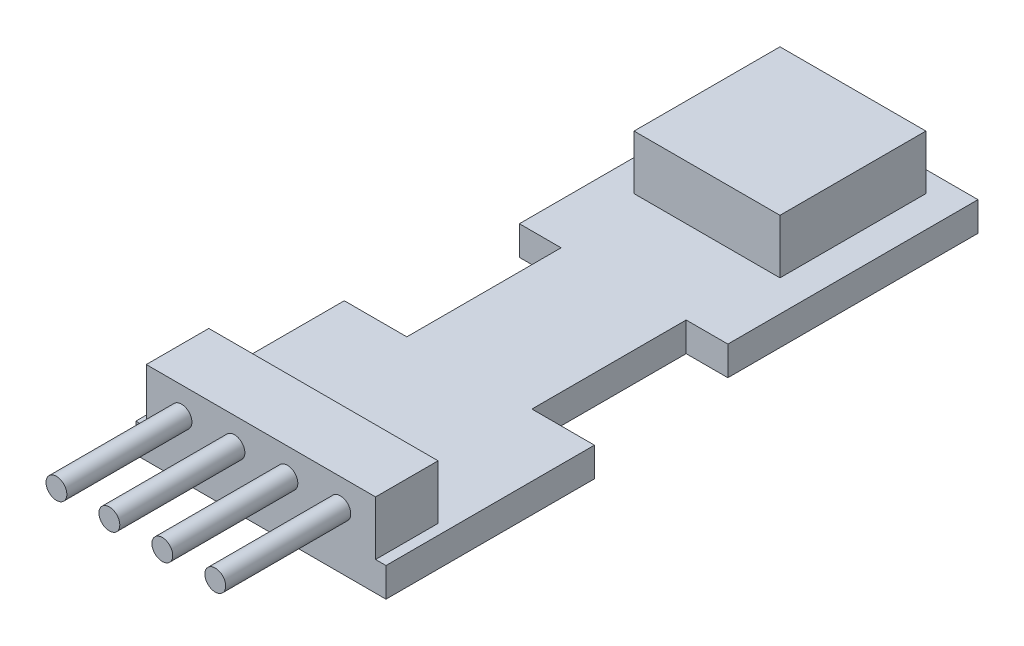
ISO-10303-21;
HEADER;
FILE_DESCRIPTION(('STEP AP214'),'2;1');
FILE_NAME('part.step','',(''),(''),'','','');
FILE_SCHEMA(('AUTOMOTIVE_DESIGN { 1 0 10303 214 1 1 1 1 }'));
ENDSEC;
DATA;
#1=APPLICATION_CONTEXT('core data for automotive mechanical design processes');
#2=APPLICATION_PROTOCOL_DEFINITION('international standard','automotive_design',2000,#1);
#3=PRODUCT_CONTEXT('',#1,'mechanical');
#4=PRODUCT('Part','Part','',(#3));
#5=PRODUCT_RELATED_PRODUCT_CATEGORY('part','',(#4));
#6=PRODUCT_DEFINITION_FORMATION('','',#4);
#7=PRODUCT_DEFINITION_CONTEXT('part definition',#1,'design');
#8=PRODUCT_DEFINITION('design','',#6,#7);
#9=PRODUCT_DEFINITION_SHAPE('','',#8);
#10=(LENGTH_UNIT() NAMED_UNIT(*) SI_UNIT(.MILLI.,.METRE.));
#11=(NAMED_UNIT(*) PLANE_ANGLE_UNIT() SI_UNIT($,.RADIAN.));
#12=(NAMED_UNIT(*) SI_UNIT($,.STERADIAN.) SOLID_ANGLE_UNIT());
#13=UNCERTAINTY_MEASURE_WITH_UNIT(LENGTH_MEASURE(1.E-05),#10,'distance_accuracy_value','');
#14=(GEOMETRIC_REPRESENTATION_CONTEXT(3) GLOBAL_UNCERTAINTY_ASSIGNED_CONTEXT((#13)) GLOBAL_UNIT_ASSIGNED_CONTEXT((#10,
#11,#12)) REPRESENTATION_CONTEXT('',''));
#15=CARTESIAN_POINT('',(0.,0.,0.));
#16=DIRECTION('',(0.,0.,1.));
#17=DIRECTION('',(1.,0.,0.));
#18=AXIS2_PLACEMENT_3D('',#15,#16,#17);
#19=CARTESIAN_POINT('',(0.,0.7,0.));
#20=DIRECTION('',(0.,1.,0.));
#21=DIRECTION('',(0.,0.,1.));
#22=AXIS2_PLACEMENT_3D('',#19,#20,#21);
#23=PLANE('',#22);
#24=DIRECTION('',(1.,0.,0.));
#25=VECTOR('',#24,1.);
#26=CARTESIAN_POINT('',(1.25,0.7,-10.7));
#27=LINE('',#26,#25);
#28=CARTESIAN_POINT('',(1.25,0.7,-10.7));
#29=VERTEX_POINT('',#28);
#30=CARTESIAN_POINT('',(4.75,0.7,-10.7));
#31=VERTEX_POINT('',#30);
#32=EDGE_CURVE('E206',#29,#31,#27,.T.);
#33=ORIENTED_EDGE('',*,*,#32,.F.);
#34=DIRECTION('',(0.,0.,1.));
#35=VECTOR('',#34,1.);
#36=CARTESIAN_POINT('',(1.25,0.7,-14.2));
#37=LINE('',#36,#35);
#38=CARTESIAN_POINT('',(1.25,0.7,-14.2));
#39=VERTEX_POINT('',#38);
#40=EDGE_CURVE('E201',#39,#29,#37,.T.);
#41=ORIENTED_EDGE('',*,*,#40,.F.);
#42=DIRECTION('',(-1.,0.,0.));
#43=VECTOR('',#42,1.);
#44=CARTESIAN_POINT('',(1.25,0.7,-14.2));
#45=LINE('',#44,#43);
#46=CARTESIAN_POINT('',(4.75,0.7,-14.2));
#47=VERTEX_POINT('',#46);
#48=EDGE_CURVE('E217',#47,#39,#45,.T.);
#49=ORIENTED_EDGE('',*,*,#48,.F.);
#50=DIRECTION('',(0.,0.,-1.));
#51=VECTOR('',#50,1.);
#52=CARTESIAN_POINT('',(4.75,0.7,-14.2));
#53=LINE('',#52,#51);
#54=EDGE_CURVE('E229',#31,#47,#53,.T.);
#55=ORIENTED_EDGE('',*,*,#54,.F.);
#56=EDGE_LOOP('',(#33,#41,#49,#55));
#57=FACE_BOUND('',#56,.T.);
#58=DIRECTION('',(1.,0.,0.));
#59=VECTOR('',#58,1.);
#60=CARTESIAN_POINT('',(0.,0.7,0.));
#61=LINE('',#60,#59);
#62=CARTESIAN_POINT('',(0.,0.7,0.));
#63=VERTEX_POINT('',#62);
#64=CARTESIAN_POINT('',(0.249999999999999,0.7,0.));
#65=VERTEX_POINT('',#64);
#66=EDGE_CURVE('E249',#63,#65,#61,.T.);
#67=ORIENTED_EDGE('',*,*,#66,.T.);
#68=DIRECTION('',(0.,0.,1.));
#69=VECTOR('',#68,1.);
#70=CARTESIAN_POINT('',(0.249999999999999,0.7,0.));
#71=LINE('',#70,#69);
#72=CARTESIAN_POINT('',(0.249999999999999,0.7,-1.5));
#73=VERTEX_POINT('',#72);
#74=EDGE_CURVE('E60',#73,#65,#71,.T.);
#75=ORIENTED_EDGE('',*,*,#74,.F.);
#76=DIRECTION('',(-1.,0.,0.));
#77=VECTOR('',#76,1.);
#78=CARTESIAN_POINT('',(0.249999999999999,0.7,-1.5));
#79=LINE('',#78,#77);
#80=CARTESIAN_POINT('',(5.75,0.7,-1.5));
#81=VERTEX_POINT('',#80);
#82=EDGE_CURVE('E55',#81,#73,#79,.T.);
#83=ORIENTED_EDGE('',*,*,#82,.F.);
#84=DIRECTION('',(0.,0.,-1.));
#85=VECTOR('',#84,1.);
#86=CARTESIAN_POINT('',(5.75,0.7,0.));
#87=LINE('',#86,#85);
#88=CARTESIAN_POINT('',(5.75,0.7,0.));
#89=VERTEX_POINT('',#88);
#90=EDGE_CURVE('E497',#89,#81,#87,.T.);
#91=ORIENTED_EDGE('',*,*,#90,.F.);
#92=CARTESIAN_POINT('',(6.,0.7,0.));
#93=VERTEX_POINT('',#92);
#94=EDGE_CURVE('E253',#89,#93,#61,.T.);
#95=ORIENTED_EDGE('',*,*,#94,.T.);
#96=DIRECTION('',(0.,0.,-1.));
#97=VECTOR('',#96,1.);
#98=CARTESIAN_POINT('',(6.,0.7,0.));
#99=LINE('',#98,#97);
#100=CARTESIAN_POINT('',(6.,0.7,-5.));
#101=VERTEX_POINT('',#100);
#102=EDGE_CURVE('E252',#93,#101,#99,.T.);
#103=ORIENTED_EDGE('',*,*,#102,.T.);
#104=DIRECTION('',(-1.,0.,0.));
#105=VECTOR('',#104,1.);
#106=CARTESIAN_POINT('',(6.,0.7,-5.));
#107=LINE('',#106,#105);
#108=CARTESIAN_POINT('',(4.5,0.7,-5.));
#109=VERTEX_POINT('',#108);
#110=EDGE_CURVE('E256',#101,#109,#107,.T.);
#111=ORIENTED_EDGE('',*,*,#110,.T.);
#112=DIRECTION('',(0.,0.,-1.));
#113=VECTOR('',#112,1.);
#114=CARTESIAN_POINT('',(4.5,0.7,-5.));
#115=LINE('',#114,#113);
#116=CARTESIAN_POINT('',(4.5,0.7,-8.7));
#117=VERTEX_POINT('',#116);
#118=EDGE_CURVE('E259',#109,#117,#115,.T.);
#119=ORIENTED_EDGE('',*,*,#118,.T.);
#120=DIRECTION('',(1.,0.,0.));
#121=VECTOR('',#120,1.);
#122=CARTESIAN_POINT('',(4.5,0.7,-8.7));
#123=LINE('',#122,#121);
#124=CARTESIAN_POINT('',(5.5,0.7,-8.7));
#125=VERTEX_POINT('',#124);
#126=EDGE_CURVE('E262',#117,#125,#123,.T.);
#127=ORIENTED_EDGE('',*,*,#126,.T.);
#128=DIRECTION('',(0.,0.,-1.));
#129=VECTOR('',#128,1.);
#130=CARTESIAN_POINT('',(5.5,0.7,-8.7));
#131=LINE('',#130,#129);
#132=CARTESIAN_POINT('',(5.5,0.7,-14.7));
#133=VERTEX_POINT('',#132);
#134=EDGE_CURVE('E265',#125,#133,#131,.T.);
#135=ORIENTED_EDGE('',*,*,#134,.T.);
#136=DIRECTION('',(-1.,0.,0.));
#137=VECTOR('',#136,1.);
#138=CARTESIAN_POINT('',(0.499999999999999,0.7,-14.7));
#139=LINE('',#138,#137);
#140=CARTESIAN_POINT('',(0.499999999999999,0.7,-14.7));
#141=VERTEX_POINT('',#140);
#142=EDGE_CURVE('E268',#133,#141,#139,.T.);
#143=ORIENTED_EDGE('',*,*,#142,.T.);
#144=DIRECTION('',(0.,0.,1.));
#145=VECTOR('',#144,1.);
#146=CARTESIAN_POINT('',(0.499999999999999,0.7,-8.7));
#147=LINE('',#146,#145);
#148=CARTESIAN_POINT('',(0.499999999999999,0.7,-8.7));
#149=VERTEX_POINT('',#148);
#150=EDGE_CURVE('E271',#141,#149,#147,.T.);
#151=ORIENTED_EDGE('',*,*,#150,.T.);
#152=DIRECTION('',(1.,0.,0.));
#153=VECTOR('',#152,1.);
#154=CARTESIAN_POINT('',(1.5,0.7,-8.7));
#155=LINE('',#154,#153);
#156=CARTESIAN_POINT('',(1.5,0.7,-8.7));
#157=VERTEX_POINT('',#156);
#158=EDGE_CURVE('E274',#149,#157,#155,.T.);
#159=ORIENTED_EDGE('',*,*,#158,.T.);
#160=DIRECTION('',(0.,0.,1.));
#161=VECTOR('',#160,1.);
#162=CARTESIAN_POINT('',(1.5,0.7,-5.));
#163=LINE('',#162,#161);
#164=CARTESIAN_POINT('',(1.5,0.7,-5.));
#165=VERTEX_POINT('',#164);
#166=EDGE_CURVE('E277',#157,#165,#163,.T.);
#167=ORIENTED_EDGE('',*,*,#166,.T.);
#168=DIRECTION('',(-1.,0.,0.));
#169=VECTOR('',#168,1.);
#170=CARTESIAN_POINT('',(0.,0.7,-5.));
#171=LINE('',#170,#169);
#172=CARTESIAN_POINT('',(0.,0.7,-5.));
#173=VERTEX_POINT('',#172);
#174=EDGE_CURVE('E280',#165,#173,#171,.T.);
#175=ORIENTED_EDGE('',*,*,#174,.T.);
#176=DIRECTION('',(0.,0.,1.));
#177=VECTOR('',#176,1.);
#178=CARTESIAN_POINT('',(0.,0.7,0.));
#179=LINE('',#178,#177);
#180=EDGE_CURVE('E283',#173,#63,#179,.T.);
#181=ORIENTED_EDGE('',*,*,#180,.T.);
#182=EDGE_LOOP('',(#67,#75,#83,#91,#95,#103,#111,#119,#127,#135,#143,#151,#159,#167,#175,#181));
#183=FACE_BOUND('',#182,.T.);
#184=ADVANCED_FACE('F39',(#57,#183),#23,.T.);
#185=CARTESIAN_POINT('',(0.,0.7,0.));
#186=DIRECTION('',(0.,0.,-1.));
#187=DIRECTION('',(-1.,0.,0.));
#188=AXIS2_PLACEMENT_3D('',#185,#186,#187);
#189=PLANE('',#188);
#190=CARTESIAN_POINT('',(4.905,1.35,0.));
#191=DIRECTION('',(0.,0.,-1.));
#192=DIRECTION('',(-1.,0.,0.));
#193=AXIS2_PLACEMENT_3D('',#190,#191,#192);
#194=CIRCLE('',#193,0.25);
#195=CARTESIAN_POINT('',(4.655,1.35,0.));
#196=VERTEX_POINT('',#195);
#197=EDGE_CURVE('E11',#196,#196,#194,.F.);
#198=ORIENTED_EDGE('',*,*,#197,.F.);
#199=EDGE_LOOP('',(#198));
#200=FACE_BOUND('',#199,.T.);
#201=CARTESIAN_POINT('',(3.635,1.35,0.));
#202=DIRECTION('',(0.,0.,-1.));
#203=DIRECTION('',(-1.,0.,0.));
#204=AXIS2_PLACEMENT_3D('',#201,#202,#203);
#205=CIRCLE('',#204,0.25);
#206=CARTESIAN_POINT('',(3.385,1.35,0.));
#207=VERTEX_POINT('',#206);
#208=EDGE_CURVE('E48',#207,#207,#205,.F.);
#209=ORIENTED_EDGE('',*,*,#208,.F.);
#210=EDGE_LOOP('',(#209));
#211=FACE_BOUND('',#210,.T.);
#212=CARTESIAN_POINT('',(2.365,1.35,0.));
#213=DIRECTION('',(0.,0.,-1.));
#214=DIRECTION('',(-1.,0.,0.));
#215=AXIS2_PLACEMENT_3D('',#212,#213,#214);
#216=CIRCLE('',#215,0.25);
#217=CARTESIAN_POINT('',(2.115,1.35,0.));
#218=VERTEX_POINT('',#217);
#219=EDGE_CURVE('E373',#218,#218,#216,.F.);
#220=ORIENTED_EDGE('',*,*,#219,.F.);
#221=EDGE_LOOP('',(#220));
#222=FACE_BOUND('',#221,.T.);
#223=CARTESIAN_POINT('',(1.095,1.35,0.));
#224=DIRECTION('',(0.,0.,-1.));
#225=DIRECTION('',(-1.,0.,0.));
#226=AXIS2_PLACEMENT_3D('',#223,#224,#225);
#227=CIRCLE('',#226,0.25);
#228=CARTESIAN_POINT('',(0.844999999999998,1.35,0.));
#229=VERTEX_POINT('',#228);
#230=EDGE_CURVE('E369',#229,#229,#227,.F.);
#231=ORIENTED_EDGE('',*,*,#230,.F.);
#232=EDGE_LOOP('',(#231));
#233=FACE_BOUND('',#232,.T.);
#234=DIRECTION('',(1.,0.,0.));
#235=VECTOR('',#234,1.);
#236=CARTESIAN_POINT('',(0.,0.,0.));
#237=LINE('',#236,#235);
#238=CARTESIAN_POINT('',(0.,0.,0.));
#239=VERTEX_POINT('',#238);
#240=CARTESIAN_POINT('',(6.,0.,0.));
#241=VERTEX_POINT('',#240);
#242=EDGE_CURVE('E248',#239,#241,#237,.T.);
#243=ORIENTED_EDGE('',*,*,#242,.T.);
#244=DIRECTION('',(0.,-1.,0.));
#245=VECTOR('',#244,1.);
#246=CARTESIAN_POINT('',(6.,0.7,0.));
#247=LINE('',#246,#245);
#248=EDGE_CURVE('E365',#93,#241,#247,.T.);
#249=ORIENTED_EDGE('',*,*,#248,.F.);
#250=ORIENTED_EDGE('',*,*,#94,.F.);
#251=DIRECTION('',(0.,-1.,0.));
#252=VECTOR('',#251,1.);
#253=CARTESIAN_POINT('',(5.75,2.,0.));
#254=LINE('',#253,#252);
#255=CARTESIAN_POINT('',(5.75,2.,0.));
#256=VERTEX_POINT('',#255);
#257=EDGE_CURVE('E183',#256,#89,#254,.T.);
#258=ORIENTED_EDGE('',*,*,#257,.F.);
#259=DIRECTION('',(1.,0.,0.));
#260=VECTOR('',#259,1.);
#261=CARTESIAN_POINT('',(0.249999999999999,2.,0.));
#262=LINE('',#261,#260);
#263=CARTESIAN_POINT('',(0.249999999999999,2.,0.));
#264=VERTEX_POINT('',#263);
#265=EDGE_CURVE('E176',#264,#256,#262,.T.);
#266=ORIENTED_EDGE('',*,*,#265,.F.);
#267=DIRECTION('',(0.,-1.,0.));
#268=VECTOR('',#267,1.);
#269=CARTESIAN_POINT('',(0.249999999999999,2.,0.));
#270=LINE('',#269,#268);
#271=EDGE_CURVE('E181',#264,#65,#270,.T.);
#272=ORIENTED_EDGE('',*,*,#271,.T.);
#273=ORIENTED_EDGE('',*,*,#66,.F.);
#274=DIRECTION('',(0.,-1.,0.));
#275=VECTOR('',#274,1.);
#276=CARTESIAN_POINT('',(0.,0.7,0.));
#277=LINE('',#276,#275);
#278=EDGE_CURVE('E286',#63,#239,#277,.T.);
#279=ORIENTED_EDGE('',*,*,#278,.T.);
#280=EDGE_LOOP('',(#243,#249,#250,#258,#266,#272,#273,#279));
#281=FACE_BOUND('',#280,.T.);
#282=ADVANCED_FACE('F41',(#200,#211,#222,#233,#281),#189,.F.);
#283=CARTESIAN_POINT('',(6.,0.7,0.));
#284=DIRECTION('',(-1.,0.,0.));
#285=DIRECTION('',(0.,0.,1.));
#286=AXIS2_PLACEMENT_3D('',#283,#284,#285);
#287=PLANE('',#286);
#288=DIRECTION('',(0.,0.,-1.));
#289=VECTOR('',#288,1.);
#290=CARTESIAN_POINT('',(6.,0.,0.));
#291=LINE('',#290,#289);
#292=CARTESIAN_POINT('',(6.,0.,-5.));
#293=VERTEX_POINT('',#292);
#294=EDGE_CURVE('E289',#241,#293,#291,.T.);
#295=ORIENTED_EDGE('',*,*,#294,.T.);
#296=DIRECTION('',(0.,-1.,0.));
#297=VECTOR('',#296,1.);
#298=CARTESIAN_POINT('',(6.,0.7,-5.));
#299=LINE('',#298,#297);
#300=EDGE_CURVE('E361',#101,#293,#299,.T.);
#301=ORIENTED_EDGE('',*,*,#300,.F.);
#302=ORIENTED_EDGE('',*,*,#102,.F.);
#303=ORIENTED_EDGE('',*,*,#248,.T.);
#304=EDGE_LOOP('',(#295,#301,#302,#303));
#305=FACE_BOUND('',#304,.T.);
#306=ADVANCED_FACE('F384',(#305),#287,.F.);
#307=CARTESIAN_POINT('',(6.,0.7,-5.));
#308=DIRECTION('',(0.,0.,1.));
#309=DIRECTION('',(1.,0.,0.));
#310=AXIS2_PLACEMENT_3D('',#307,#308,#309);
#311=PLANE('',#310);
#312=DIRECTION('',(-1.,0.,0.));
#313=VECTOR('',#312,1.);
#314=CARTESIAN_POINT('',(6.,0.,-5.));
#315=LINE('',#314,#313);
#316=CARTESIAN_POINT('',(4.5,0.,-5.));
#317=VERTEX_POINT('',#316);
#318=EDGE_CURVE('E292',#293,#317,#315,.T.);
#319=ORIENTED_EDGE('',*,*,#318,.T.);
#320=DIRECTION('',(0.,-1.,0.));
#321=VECTOR('',#320,1.);
#322=CARTESIAN_POINT('',(4.5,0.7,-5.));
#323=LINE('',#322,#321);
#324=EDGE_CURVE('E357',#109,#317,#323,.T.);
#325=ORIENTED_EDGE('',*,*,#324,.F.);
#326=ORIENTED_EDGE('',*,*,#110,.F.);
#327=ORIENTED_EDGE('',*,*,#300,.T.);
#328=EDGE_LOOP('',(#319,#325,#326,#327));
#329=FACE_BOUND('',#328,.T.);
#330=ADVANCED_FACE('F454',(#329),#311,.F.);
#331=CARTESIAN_POINT('',(4.5,0.7,-5.));
#332=DIRECTION('',(-1.,0.,0.));
#333=DIRECTION('',(0.,0.,1.));
#334=AXIS2_PLACEMENT_3D('',#331,#332,#333);
#335=PLANE('',#334);
#336=DIRECTION('',(0.,0.,-1.));
#337=VECTOR('',#336,1.);
#338=CARTESIAN_POINT('',(4.5,0.,-5.));
#339=LINE('',#338,#337);
#340=CARTESIAN_POINT('',(4.5,0.,-8.7));
#341=VERTEX_POINT('',#340);
#342=EDGE_CURVE('E295',#317,#341,#339,.T.);
#343=ORIENTED_EDGE('',*,*,#342,.T.);
#344=DIRECTION('',(0.,-1.,0.));
#345=VECTOR('',#344,1.);
#346=CARTESIAN_POINT('',(4.5,0.7,-8.7));
#347=LINE('',#346,#345);
#348=EDGE_CURVE('E353',#117,#341,#347,.T.);
#349=ORIENTED_EDGE('',*,*,#348,.F.);
#350=ORIENTED_EDGE('',*,*,#118,.F.);
#351=ORIENTED_EDGE('',*,*,#324,.T.);
#352=EDGE_LOOP('',(#343,#349,#350,#351));
#353=FACE_BOUND('',#352,.T.);
#354=ADVANCED_FACE('F450',(#353),#335,.F.);
#355=CARTESIAN_POINT('',(4.5,0.7,-8.7));
#356=DIRECTION('',(0.,0.,-1.));
#357=DIRECTION('',(-1.,0.,0.));
#358=AXIS2_PLACEMENT_3D('',#355,#356,#357);
#359=PLANE('',#358);
#360=DIRECTION('',(1.,0.,0.));
#361=VECTOR('',#360,1.);
#362=CARTESIAN_POINT('',(4.5,0.,-8.7));
#363=LINE('',#362,#361);
#364=CARTESIAN_POINT('',(5.5,0.,-8.7));
#365=VERTEX_POINT('',#364);
#366=EDGE_CURVE('E298',#341,#365,#363,.T.);
#367=ORIENTED_EDGE('',*,*,#366,.T.);
#368=DIRECTION('',(0.,-1.,0.));
#369=VECTOR('',#368,1.);
#370=CARTESIAN_POINT('',(5.5,0.7,-8.7));
#371=LINE('',#370,#369);
#372=EDGE_CURVE('E349',#125,#365,#371,.T.);
#373=ORIENTED_EDGE('',*,*,#372,.F.);
#374=ORIENTED_EDGE('',*,*,#126,.F.);
#375=ORIENTED_EDGE('',*,*,#348,.T.);
#376=EDGE_LOOP('',(#367,#373,#374,#375));
#377=FACE_BOUND('',#376,.T.);
#378=ADVANCED_FACE('F446',(#377),#359,.F.);
#379=CARTESIAN_POINT('',(5.5,0.7,-8.7));
#380=DIRECTION('',(-1.,0.,0.));
#381=DIRECTION('',(0.,0.,1.));
#382=AXIS2_PLACEMENT_3D('',#379,#380,#381);
#383=PLANE('',#382);
#384=DIRECTION('',(0.,0.,-1.));
#385=VECTOR('',#384,1.);
#386=CARTESIAN_POINT('',(5.5,0.,-8.7));
#387=LINE('',#386,#385);
#388=CARTESIAN_POINT('',(5.5,0.,-14.7));
#389=VERTEX_POINT('',#388);
#390=EDGE_CURVE('E301',#365,#389,#387,.T.);
#391=ORIENTED_EDGE('',*,*,#390,.T.);
#392=DIRECTION('',(0.,-1.,0.));
#393=VECTOR('',#392,1.);
#394=CARTESIAN_POINT('',(5.5,0.7,-14.7));
#395=LINE('',#394,#393);
#396=EDGE_CURVE('E345',#133,#389,#395,.T.);
#397=ORIENTED_EDGE('',*,*,#396,.F.);
#398=ORIENTED_EDGE('',*,*,#134,.F.);
#399=ORIENTED_EDGE('',*,*,#372,.T.);
#400=EDGE_LOOP('',(#391,#397,#398,#399));
#401=FACE_BOUND('',#400,.T.);
#402=ADVANCED_FACE('F442',(#401),#383,.F.);
#403=CARTESIAN_POINT('',(0.499999999999999,0.7,-14.7));
#404=DIRECTION('',(0.,0.,1.));
#405=DIRECTION('',(1.,0.,0.));
#406=AXIS2_PLACEMENT_3D('',#403,#404,#405);
#407=PLANE('',#406);
#408=DIRECTION('',(-1.,0.,0.));
#409=VECTOR('',#408,1.);
#410=CARTESIAN_POINT('',(0.499999999999999,0.,-14.7));
#411=LINE('',#410,#409);
#412=CARTESIAN_POINT('',(0.499999999999999,0.,-14.7));
#413=VERTEX_POINT('',#412);
#414=EDGE_CURVE('E304',#389,#413,#411,.T.);
#415=ORIENTED_EDGE('',*,*,#414,.T.);
#416=DIRECTION('',(0.,-1.,0.));
#417=VECTOR('',#416,1.);
#418=CARTESIAN_POINT('',(0.499999999999999,0.7,-14.7));
#419=LINE('',#418,#417);
#420=EDGE_CURVE('E341',#141,#413,#419,.T.);
#421=ORIENTED_EDGE('',*,*,#420,.F.);
#422=ORIENTED_EDGE('',*,*,#142,.F.);
#423=ORIENTED_EDGE('',*,*,#396,.T.);
#424=EDGE_LOOP('',(#415,#421,#422,#423));
#425=FACE_BOUND('',#424,.T.);
#426=ADVANCED_FACE('F438',(#425),#407,.F.);
#427=CARTESIAN_POINT('',(0.499999999999999,0.7,-8.7));
#428=DIRECTION('',(1.,0.,0.));
#429=DIRECTION('',(0.,0.,-1.));
#430=AXIS2_PLACEMENT_3D('',#427,#428,#429);
#431=PLANE('',#430);
#432=DIRECTION('',(0.,0.,1.));
#433=VECTOR('',#432,1.);
#434=CARTESIAN_POINT('',(0.499999999999999,0.,-8.7));
#435=LINE('',#434,#433);
#436=CARTESIAN_POINT('',(0.499999999999999,0.,-8.7));
#437=VERTEX_POINT('',#436);
#438=EDGE_CURVE('E307',#413,#437,#435,.T.);
#439=ORIENTED_EDGE('',*,*,#438,.T.);
#440=DIRECTION('',(0.,-1.,0.));
#441=VECTOR('',#440,1.);
#442=CARTESIAN_POINT('',(0.499999999999999,0.7,-8.7));
#443=LINE('',#442,#441);
#444=EDGE_CURVE('E337',#149,#437,#443,.T.);
#445=ORIENTED_EDGE('',*,*,#444,.F.);
#446=ORIENTED_EDGE('',*,*,#150,.F.);
#447=ORIENTED_EDGE('',*,*,#420,.T.);
#448=EDGE_LOOP('',(#439,#445,#446,#447));
#449=FACE_BOUND('',#448,.T.);
#450=ADVANCED_FACE('F434',(#449),#431,.F.);
#451=CARTESIAN_POINT('',(1.5,0.7,-8.7));
#452=DIRECTION('',(0.,0.,-1.));
#453=DIRECTION('',(-1.,0.,0.));
#454=AXIS2_PLACEMENT_3D('',#451,#452,#453);
#455=PLANE('',#454);
#456=DIRECTION('',(1.,0.,0.));
#457=VECTOR('',#456,1.);
#458=CARTESIAN_POINT('',(1.5,0.,-8.7));
#459=LINE('',#458,#457);
#460=CARTESIAN_POINT('',(1.5,0.,-8.7));
#461=VERTEX_POINT('',#460);
#462=EDGE_CURVE('E310',#437,#461,#459,.T.);
#463=ORIENTED_EDGE('',*,*,#462,.T.);
#464=DIRECTION('',(0.,-1.,0.));
#465=VECTOR('',#464,1.);
#466=CARTESIAN_POINT('',(1.5,0.7,-8.7));
#467=LINE('',#466,#465);
#468=EDGE_CURVE('E333',#157,#461,#467,.T.);
#469=ORIENTED_EDGE('',*,*,#468,.F.);
#470=ORIENTED_EDGE('',*,*,#158,.F.);
#471=ORIENTED_EDGE('',*,*,#444,.T.);
#472=EDGE_LOOP('',(#463,#469,#470,#471));
#473=FACE_BOUND('',#472,.T.);
#474=ADVANCED_FACE('F430',(#473),#455,.F.);
#475=CARTESIAN_POINT('',(1.5,0.7,-5.));
#476=DIRECTION('',(1.,0.,0.));
#477=DIRECTION('',(0.,0.,-1.));
#478=AXIS2_PLACEMENT_3D('',#475,#476,#477);
#479=PLANE('',#478);
#480=DIRECTION('',(0.,0.,1.));
#481=VECTOR('',#480,1.);
#482=CARTESIAN_POINT('',(1.5,0.,-5.));
#483=LINE('',#482,#481);
#484=CARTESIAN_POINT('',(1.5,0.,-5.));
#485=VERTEX_POINT('',#484);
#486=EDGE_CURVE('E313',#461,#485,#483,.T.);
#487=ORIENTED_EDGE('',*,*,#486,.T.);
#488=DIRECTION('',(0.,-1.,0.));
#489=VECTOR('',#488,1.);
#490=CARTESIAN_POINT('',(1.5,0.7,-5.));
#491=LINE('',#490,#489);
#492=EDGE_CURVE('E329',#165,#485,#491,.T.);
#493=ORIENTED_EDGE('',*,*,#492,.F.);
#494=ORIENTED_EDGE('',*,*,#166,.F.);
#495=ORIENTED_EDGE('',*,*,#468,.T.);
#496=EDGE_LOOP('',(#487,#493,#494,#495));
#497=FACE_BOUND('',#496,.T.);
#498=ADVANCED_FACE('F426',(#497),#479,.F.);
#499=CARTESIAN_POINT('',(0.,0.7,-5.));
#500=DIRECTION('',(0.,0.,1.));
#501=DIRECTION('',(1.,0.,0.));
#502=AXIS2_PLACEMENT_3D('',#499,#500,#501);
#503=PLANE('',#502);
#504=DIRECTION('',(-1.,0.,0.));
#505=VECTOR('',#504,1.);
#506=CARTESIAN_POINT('',(0.,0.,-5.));
#507=LINE('',#506,#505);
#508=CARTESIAN_POINT('',(0.,0.,-5.));
#509=VERTEX_POINT('',#508);
#510=EDGE_CURVE('E316',#485,#509,#507,.T.);
#511=ORIENTED_EDGE('',*,*,#510,.T.);
#512=DIRECTION('',(0.,-1.,0.));
#513=VECTOR('',#512,1.);
#514=CARTESIAN_POINT('',(0.,0.7,-5.));
#515=LINE('',#514,#513);
#516=EDGE_CURVE('E325',#173,#509,#515,.T.);
#517=ORIENTED_EDGE('',*,*,#516,.F.);
#518=ORIENTED_EDGE('',*,*,#174,.F.);
#519=ORIENTED_EDGE('',*,*,#492,.T.);
#520=EDGE_LOOP('',(#511,#517,#518,#519));
#521=FACE_BOUND('',#520,.T.);
#522=ADVANCED_FACE('F422',(#521),#503,.F.);
#523=CARTESIAN_POINT('',(0.,0.7,0.));
#524=DIRECTION('',(1.,0.,0.));
#525=DIRECTION('',(0.,0.,-1.));
#526=AXIS2_PLACEMENT_3D('',#523,#524,#525);
#527=PLANE('',#526);
#528=DIRECTION('',(0.,0.,1.));
#529=VECTOR('',#528,1.);
#530=CARTESIAN_POINT('',(0.,0.,0.));
#531=LINE('',#530,#529);
#532=EDGE_CURVE('E319',#509,#239,#531,.T.);
#533=ORIENTED_EDGE('',*,*,#532,.T.);
#534=ORIENTED_EDGE('',*,*,#278,.F.);
#535=ORIENTED_EDGE('',*,*,#180,.F.);
#536=ORIENTED_EDGE('',*,*,#516,.T.);
#537=EDGE_LOOP('',(#533,#534,#535,#536));
#538=FACE_BOUND('',#537,.T.);
#539=ADVANCED_FACE('F418',(#538),#527,.F.);
#540=CARTESIAN_POINT('',(0.,0.,0.));
#541=DIRECTION('',(0.,1.,0.));
#542=DIRECTION('',(0.,0.,1.));
#543=AXIS2_PLACEMENT_3D('',#540,#541,#542);
#544=PLANE('',#543);
#545=ORIENTED_EDGE('',*,*,#242,.F.);
#546=ORIENTED_EDGE('',*,*,#532,.F.);
#547=ORIENTED_EDGE('',*,*,#510,.F.);
#548=ORIENTED_EDGE('',*,*,#486,.F.);
#549=ORIENTED_EDGE('',*,*,#462,.F.);
#550=ORIENTED_EDGE('',*,*,#438,.F.);
#551=ORIENTED_EDGE('',*,*,#414,.F.);
#552=ORIENTED_EDGE('',*,*,#390,.F.);
#553=ORIENTED_EDGE('',*,*,#366,.F.);
#554=ORIENTED_EDGE('',*,*,#342,.F.);
#555=ORIENTED_EDGE('',*,*,#318,.F.);
#556=ORIENTED_EDGE('',*,*,#294,.F.);
#557=EDGE_LOOP('',(#545,#546,#547,#548,#549,#550,#551,#552,#553,#554,#555,#556));
#558=FACE_BOUND('',#557,.T.);
#559=ADVANCED_FACE('F415',(#558),#544,.F.);
#560=CARTESIAN_POINT('',(1.25,2.,-14.2));
#561=DIRECTION('',(1.,0.,0.));
#562=DIRECTION('',(0.,0.,-1.));
#563=AXIS2_PLACEMENT_3D('',#560,#561,#562);
#564=PLANE('',#563);
#565=ORIENTED_EDGE('',*,*,#40,.T.);
#566=DIRECTION('',(0.,-1.,0.));
#567=VECTOR('',#566,1.);
#568=CARTESIAN_POINT('',(1.25,2.,-10.7));
#569=LINE('',#568,#567);
#570=CARTESIAN_POINT('',(1.25,2.,-10.7));
#571=VERTEX_POINT('',#570);
#572=EDGE_CURVE('E245',#571,#29,#569,.T.);
#573=ORIENTED_EDGE('',*,*,#572,.F.);
#574=DIRECTION('',(0.,0.,1.));
#575=VECTOR('',#574,1.);
#576=CARTESIAN_POINT('',(1.25,2.,-14.2));
#577=LINE('',#576,#575);
#578=CARTESIAN_POINT('',(1.25,2.,-14.2));
#579=VERTEX_POINT('',#578);
#580=EDGE_CURVE('E212',#579,#571,#577,.T.);
#581=ORIENTED_EDGE('',*,*,#580,.F.);
#582=DIRECTION('',(0.,-1.,0.));
#583=VECTOR('',#582,1.);
#584=CARTESIAN_POINT('',(1.25,2.,-14.2));
#585=LINE('',#584,#583);
#586=EDGE_CURVE('E225',#579,#39,#585,.T.);
#587=ORIENTED_EDGE('',*,*,#586,.T.);
#588=EDGE_LOOP('',(#565,#573,#581,#587));
#589=FACE_BOUND('',#588,.T.);
#590=ADVANCED_FACE('F413',(#589),#564,.F.);
#591=CARTESIAN_POINT('',(1.25,2.,-10.7));
#592=DIRECTION('',(0.,0.,-1.));
#593=DIRECTION('',(-1.,0.,0.));
#594=AXIS2_PLACEMENT_3D('',#591,#592,#593);
#595=PLANE('',#594);
#596=ORIENTED_EDGE('',*,*,#32,.T.);
#597=DIRECTION('',(0.,-1.,0.));
#598=VECTOR('',#597,1.);
#599=CARTESIAN_POINT('',(4.75,2.,-10.7));
#600=LINE('',#599,#598);
#601=CARTESIAN_POINT('',(4.75,2.,-10.7));
#602=VERTEX_POINT('',#601);
#603=EDGE_CURVE('E241',#602,#31,#600,.T.);
#604=ORIENTED_EDGE('',*,*,#603,.F.);
#605=DIRECTION('',(1.,0.,0.));
#606=VECTOR('',#605,1.);
#607=CARTESIAN_POINT('',(1.25,2.,-10.7));
#608=LINE('',#607,#606);
#609=EDGE_CURVE('E216',#571,#602,#608,.T.);
#610=ORIENTED_EDGE('',*,*,#609,.F.);
#611=ORIENTED_EDGE('',*,*,#572,.T.);
#612=EDGE_LOOP('',(#596,#604,#610,#611));
#613=FACE_BOUND('',#612,.T.);
#614=ADVANCED_FACE('F537',(#613),#595,.F.);
#615=CARTESIAN_POINT('',(4.75,2.,-14.2));
#616=DIRECTION('',(-1.,0.,0.));
#617=DIRECTION('',(0.,0.,1.));
#618=AXIS2_PLACEMENT_3D('',#615,#616,#617);
#619=PLANE('',#618);
#620=ORIENTED_EDGE('',*,*,#54,.T.);
#621=DIRECTION('',(0.,-1.,0.));
#622=VECTOR('',#621,1.);
#623=CARTESIAN_POINT('',(4.75,2.,-14.2));
#624=LINE('',#623,#622);
#625=CARTESIAN_POINT('',(4.75,2.,-14.2));
#626=VERTEX_POINT('',#625);
#627=EDGE_CURVE('E238',#626,#47,#624,.T.);
#628=ORIENTED_EDGE('',*,*,#627,.F.);
#629=DIRECTION('',(0.,0.,-1.));
#630=VECTOR('',#629,1.);
#631=CARTESIAN_POINT('',(4.75,2.,-14.2));
#632=LINE('',#631,#630);
#633=EDGE_CURVE('E220',#602,#626,#632,.T.);
#634=ORIENTED_EDGE('',*,*,#633,.F.);
#635=ORIENTED_EDGE('',*,*,#603,.T.);
#636=EDGE_LOOP('',(#620,#628,#634,#635));
#637=FACE_BOUND('',#636,.T.);
#638=ADVANCED_FACE('F534',(#637),#619,.F.);
#639=CARTESIAN_POINT('',(1.25,2.,-14.2));
#640=DIRECTION('',(0.,0.,1.));
#641=DIRECTION('',(1.,0.,0.));
#642=AXIS2_PLACEMENT_3D('',#639,#640,#641);
#643=PLANE('',#642);
#644=ORIENTED_EDGE('',*,*,#48,.T.);
#645=ORIENTED_EDGE('',*,*,#586,.F.);
#646=DIRECTION('',(-1.,0.,0.));
#647=VECTOR('',#646,1.);
#648=CARTESIAN_POINT('',(1.25,2.,-14.2));
#649=LINE('',#648,#647);
#650=EDGE_CURVE('E223',#626,#579,#649,.T.);
#651=ORIENTED_EDGE('',*,*,#650,.F.);
#652=ORIENTED_EDGE('',*,*,#627,.T.);
#653=EDGE_LOOP('',(#644,#645,#651,#652));
#654=FACE_BOUND('',#653,.T.);
#655=ADVANCED_FACE('F530',(#654),#643,.F.);
#656=CARTESIAN_POINT('',(0.,2.,0.));
#657=DIRECTION('',(0.,1.,0.));
#658=DIRECTION('',(0.,0.,1.));
#659=AXIS2_PLACEMENT_3D('',#656,#657,#658);
#660=PLANE('',#659);
#661=ORIENTED_EDGE('',*,*,#580,.T.);
#662=ORIENTED_EDGE('',*,*,#609,.T.);
#663=ORIENTED_EDGE('',*,*,#633,.T.);
#664=ORIENTED_EDGE('',*,*,#650,.T.);
#665=EDGE_LOOP('',(#661,#662,#663,#664));
#666=FACE_BOUND('',#665,.T.);
#667=ADVANCED_FACE('F527',(#666),#660,.T.);
#668=CARTESIAN_POINT('',(0.249999999999999,2.,0.));
#669=DIRECTION('',(1.,0.,0.));
#670=DIRECTION('',(0.,0.,-1.));
#671=AXIS2_PLACEMENT_3D('',#668,#669,#670);
#672=PLANE('',#671);
#673=ORIENTED_EDGE('',*,*,#74,.T.);
#674=ORIENTED_EDGE('',*,*,#271,.F.);
#675=DIRECTION('',(0.,0.,1.));
#676=VECTOR('',#675,1.);
#677=CARTESIAN_POINT('',(0.249999999999999,2.,0.));
#678=LINE('',#677,#676);
#679=CARTESIAN_POINT('',(0.249999999999999,2.,-1.5));
#680=VERTEX_POINT('',#679);
#681=EDGE_CURVE('E188',#680,#264,#678,.T.);
#682=ORIENTED_EDGE('',*,*,#681,.F.);
#683=DIRECTION('',(0.,-1.,0.));
#684=VECTOR('',#683,1.);
#685=CARTESIAN_POINT('',(0.249999999999999,2.,-1.5));
#686=LINE('',#685,#684);
#687=EDGE_CURVE('E507',#680,#73,#686,.T.);
#688=ORIENTED_EDGE('',*,*,#687,.T.);
#689=EDGE_LOOP('',(#673,#674,#682,#688));
#690=FACE_BOUND('',#689,.T.);
#691=ADVANCED_FACE('F199',(#690),#672,.F.);
#692=CARTESIAN_POINT('',(5.75,2.,0.));
#693=DIRECTION('',(-1.,0.,0.));
#694=DIRECTION('',(0.,0.,1.));
#695=AXIS2_PLACEMENT_3D('',#692,#693,#694);
#696=PLANE('',#695);
#697=ORIENTED_EDGE('',*,*,#90,.T.);
#698=DIRECTION('',(0.,-1.,0.));
#699=VECTOR('',#698,1.);
#700=CARTESIAN_POINT('',(5.75,2.,-1.5));
#701=LINE('',#700,#699);
#702=CARTESIAN_POINT('',(5.75,2.,-1.5));
#703=VERTEX_POINT('',#702);
#704=EDGE_CURVE('E208',#703,#81,#701,.T.);
#705=ORIENTED_EDGE('',*,*,#704,.F.);
#706=DIRECTION('',(0.,0.,-1.));
#707=VECTOR('',#706,1.);
#708=CARTESIAN_POINT('',(5.75,2.,0.));
#709=LINE('',#708,#707);
#710=EDGE_CURVE('E187',#256,#703,#709,.T.);
#711=ORIENTED_EDGE('',*,*,#710,.F.);
#712=ORIENTED_EDGE('',*,*,#257,.T.);
#713=EDGE_LOOP('',(#697,#705,#711,#712));
#714=FACE_BOUND('',#713,.T.);
#715=ADVANCED_FACE('F503',(#714),#696,.F.);
#716=CARTESIAN_POINT('',(0.249999999999999,2.,-1.5));
#717=DIRECTION('',(0.,0.,1.));
#718=DIRECTION('',(1.,0.,0.));
#719=AXIS2_PLACEMENT_3D('',#716,#717,#718);
#720=PLANE('',#719);
#721=ORIENTED_EDGE('',*,*,#82,.T.);
#722=ORIENTED_EDGE('',*,*,#687,.F.);
#723=DIRECTION('',(-1.,0.,0.));
#724=VECTOR('',#723,1.);
#725=CARTESIAN_POINT('',(0.249999999999999,2.,-1.5));
#726=LINE('',#725,#724);
#727=EDGE_CURVE('E193',#703,#680,#726,.T.);
#728=ORIENTED_EDGE('',*,*,#727,.F.);
#729=ORIENTED_EDGE('',*,*,#704,.T.);
#730=EDGE_LOOP('',(#721,#722,#728,#729));
#731=FACE_BOUND('',#730,.T.);
#732=ADVANCED_FACE('F402',(#731),#720,.F.);
#733=CARTESIAN_POINT('',(0.,2.,0.));
#734=DIRECTION('',(0.,-1.,0.));
#735=DIRECTION('',(0.,0.,-1.));
#736=AXIS2_PLACEMENT_3D('',#733,#734,#735);
#737=PLANE('',#736);
#738=ORIENTED_EDGE('',*,*,#681,.T.);
#739=ORIENTED_EDGE('',*,*,#265,.T.);
#740=ORIENTED_EDGE('',*,*,#710,.T.);
#741=ORIENTED_EDGE('',*,*,#727,.T.);
#742=EDGE_LOOP('',(#738,#739,#740,#741));
#743=FACE_BOUND('',#742,.T.);
#744=ADVANCED_FACE('F191',(#743),#737,.F.);
#745=CARTESIAN_POINT('',(1.095,1.35,3.));
#746=DIRECTION('',(0.,0.,-1.));
#747=DIRECTION('',(-1.,0.,0.));
#748=AXIS2_PLACEMENT_3D('',#745,#746,#747);
#749=CYLINDRICAL_SURFACE('',#748,0.25);
#750=CARTESIAN_POINT('',(1.095,1.35,3.));
#751=DIRECTION('',(0.,0.,1.));
#752=DIRECTION('',(1.,0.,0.));
#753=AXIS2_PLACEMENT_3D('',#750,#751,#752);
#754=CIRCLE('',#753,0.25);
#755=CARTESIAN_POINT('',(1.345,1.35,3.));
#756=VERTEX_POINT('',#755);
#757=EDGE_CURVE('E511',#756,#756,#754,.T.);
#758=ORIENTED_EDGE('',*,*,#757,.F.);
#759=EDGE_LOOP('',(#758));
#760=FACE_BOUND('',#759,.T.);
#761=ORIENTED_EDGE('',*,*,#230,.T.);
#762=EDGE_LOOP('',(#761));
#763=FACE_BOUND('',#762,.T.);
#764=ADVANCED_FACE('F390',(#760,#763),#749,.T.);
#765=CARTESIAN_POINT('',(1.095,1.35,3.));
#766=DIRECTION('',(0.,0.,1.));
#767=DIRECTION('',(1.,0.,0.));
#768=AXIS2_PLACEMENT_3D('',#765,#766,#767);
#769=PLANE('',#768);
#770=ORIENTED_EDGE('',*,*,#757,.T.);
#771=EDGE_LOOP('',(#770));
#772=FACE_BOUND('',#771,.T.);
#773=ADVANCED_FACE('F392',(#772),#769,.T.);
#774=CARTESIAN_POINT('',(2.365,1.35,3.));
#775=DIRECTION('',(0.,0.,-1.));
#776=DIRECTION('',(-1.,0.,0.));
#777=AXIS2_PLACEMENT_3D('',#774,#775,#776);
#778=CYLINDRICAL_SURFACE('',#777,0.25);
#779=CARTESIAN_POINT('',(2.365,1.35,3.));
#780=DIRECTION('',(0.,0.,1.));
#781=DIRECTION('',(1.,0.,0.));
#782=AXIS2_PLACEMENT_3D('',#779,#780,#781);
#783=CIRCLE('',#782,0.25);
#784=CARTESIAN_POINT('',(2.615,1.35,3.));
#785=VERTEX_POINT('',#784);
#786=EDGE_CURVE('E736',#785,#785,#783,.T.);
#787=ORIENTED_EDGE('',*,*,#786,.F.);
#788=EDGE_LOOP('',(#787));
#789=FACE_BOUND('',#788,.T.);
#790=ORIENTED_EDGE('',*,*,#219,.T.);
#791=EDGE_LOOP('',(#790));
#792=FACE_BOUND('',#791,.T.);
#793=ADVANCED_FACE('F399',(#789,#792),#778,.T.);
#794=CARTESIAN_POINT('',(2.365,1.35,3.));
#795=DIRECTION('',(0.,0.,1.));
#796=DIRECTION('',(1.,0.,0.));
#797=AXIS2_PLACEMENT_3D('',#794,#795,#796);
#798=PLANE('',#797);
#799=ORIENTED_EDGE('',*,*,#786,.T.);
#800=EDGE_LOOP('',(#799));
#801=FACE_BOUND('',#800,.T.);
#802=ADVANCED_FACE('F675',(#801),#798,.T.);
#803=CARTESIAN_POINT('',(3.635,1.35,3.));
#804=DIRECTION('',(0.,0.,-1.));
#805=DIRECTION('',(-1.,0.,0.));
#806=AXIS2_PLACEMENT_3D('',#803,#804,#805);
#807=CYLINDRICAL_SURFACE('',#806,0.25);
#808=CARTESIAN_POINT('',(3.635,1.35,3.));
#809=DIRECTION('',(0.,0.,1.));
#810=DIRECTION('',(1.,0.,0.));
#811=AXIS2_PLACEMENT_3D('',#808,#809,#810);
#812=CIRCLE('',#811,0.25);
#813=CARTESIAN_POINT('',(3.885,1.35,3.));
#814=VERTEX_POINT('',#813);
#815=EDGE_CURVE('E732',#814,#814,#812,.T.);
#816=ORIENTED_EDGE('',*,*,#815,.F.);
#817=EDGE_LOOP('',(#816));
#818=FACE_BOUND('',#817,.T.);
#819=ORIENTED_EDGE('',*,*,#208,.T.);
#820=EDGE_LOOP('',(#819));
#821=FACE_BOUND('',#820,.T.);
#822=ADVANCED_FACE('F380',(#818,#821),#807,.T.);
#823=CARTESIAN_POINT('',(3.635,1.35,3.));
#824=DIRECTION('',(0.,0.,1.));
#825=DIRECTION('',(1.,0.,0.));
#826=AXIS2_PLACEMENT_3D('',#823,#824,#825);
#827=PLANE('',#826);
#828=ORIENTED_EDGE('',*,*,#815,.T.);
#829=EDGE_LOOP('',(#828));
#830=FACE_BOUND('',#829,.T.);
#831=ADVANCED_FACE('F692',(#830),#827,.T.);
#832=CARTESIAN_POINT('',(4.905,1.35,3.));
#833=DIRECTION('',(0.,0.,-1.));
#834=DIRECTION('',(-1.,0.,0.));
#835=AXIS2_PLACEMENT_3D('',#832,#833,#834);
#836=CYLINDRICAL_SURFACE('',#835,0.25);
#837=CARTESIAN_POINT('',(4.905,1.35,3.));
#838=DIRECTION('',(0.,0.,1.));
#839=DIRECTION('',(1.,0.,0.));
#840=AXIS2_PLACEMENT_3D('',#837,#838,#839);
#841=CIRCLE('',#840,0.25);
#842=CARTESIAN_POINT('',(5.155,1.35,3.));
#843=VERTEX_POINT('',#842);
#844=EDGE_CURVE('E730',#843,#843,#841,.T.);
#845=ORIENTED_EDGE('',*,*,#844,.F.);
#846=EDGE_LOOP('',(#845));
#847=FACE_BOUND('',#846,.T.);
#848=ORIENTED_EDGE('',*,*,#197,.T.);
#849=EDGE_LOOP('',(#848));
#850=FACE_BOUND('',#849,.T.);
#851=ADVANCED_FACE('F701',(#847,#850),#836,.T.);
#852=CARTESIAN_POINT('',(4.905,1.35,3.));
#853=DIRECTION('',(0.,0.,1.));
#854=DIRECTION('',(1.,0.,0.));
#855=AXIS2_PLACEMENT_3D('',#852,#853,#854);
#856=PLANE('',#855);
#857=ORIENTED_EDGE('',*,*,#844,.T.);
#858=EDGE_LOOP('',(#857));
#859=FACE_BOUND('',#858,.T.);
#860=ADVANCED_FACE('F710',(#859),#856,.T.);
#861=CLOSED_SHELL('',(#184,#282,#306,#330,#354,#378,#402,#426,#450,#474,#498,#522,#539,#559,
#590,#614,#638,#655,#667,#691,#715,#732,#744,#764,#773,#793,#802,#822,#831,#851,#860));
#862=MANIFOLD_SOLID_BREP('B2',#861);
#863=ADVANCED_BREP_SHAPE_REPRESENTATION('',(#18,#862),#14);
#864=SHAPE_DEFINITION_REPRESENTATION(#9,#863);
ENDSEC;
END-ISO-10303-21;
